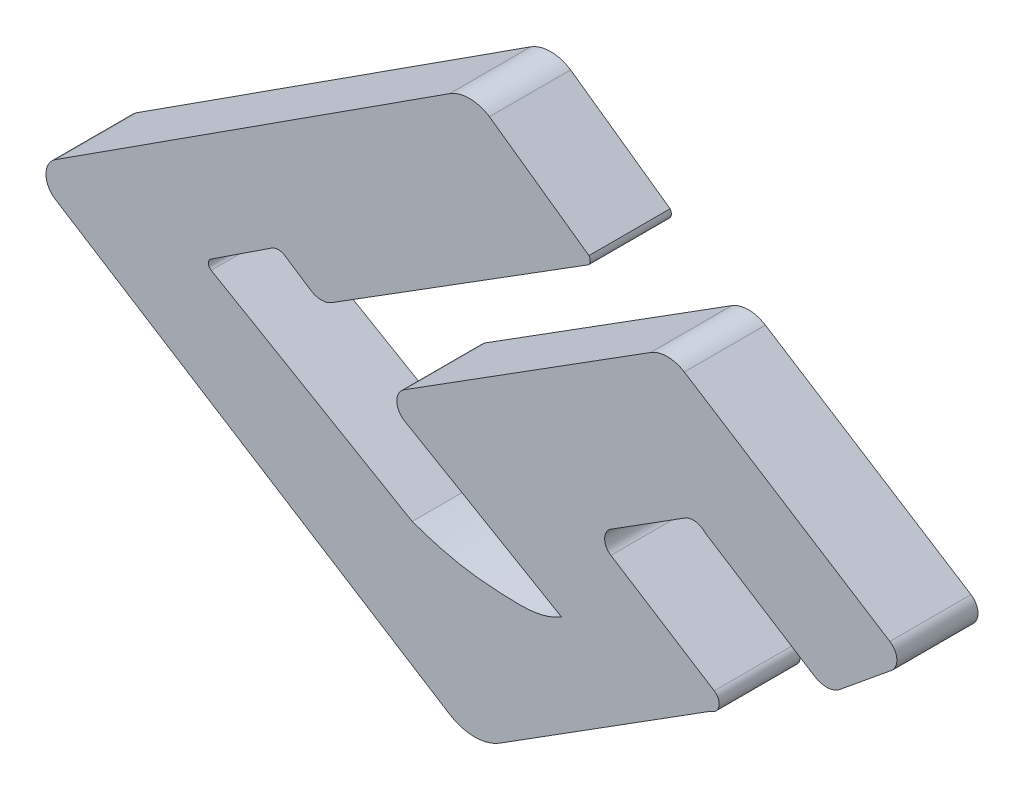
ISO-10303-21;
HEADER;
FILE_DESCRIPTION(('STEP AP214'),'2;1');
FILE_NAME('part.step','',(''),(''),'','','');
FILE_SCHEMA(('AUTOMOTIVE_DESIGN { 1 0 10303 214 1 1 1 1 }'));
ENDSEC;
DATA;
#1=APPLICATION_CONTEXT('core data for automotive mechanical design processes');
#2=APPLICATION_PROTOCOL_DEFINITION('international standard','automotive_design',2000,#1);
#3=PRODUCT_CONTEXT('',#1,'mechanical');
#4=PRODUCT('Part','Part','',(#3));
#5=PRODUCT_RELATED_PRODUCT_CATEGORY('part','',(#4));
#6=PRODUCT_DEFINITION_FORMATION('','',#4);
#7=PRODUCT_DEFINITION_CONTEXT('part definition',#1,'design');
#8=PRODUCT_DEFINITION('design','',#6,#7);
#9=PRODUCT_DEFINITION_SHAPE('','',#8);
#10=(LENGTH_UNIT() NAMED_UNIT(*) SI_UNIT(.MILLI.,.METRE.));
#11=(NAMED_UNIT(*) PLANE_ANGLE_UNIT() SI_UNIT($,.RADIAN.));
#12=(NAMED_UNIT(*) SI_UNIT($,.STERADIAN.) SOLID_ANGLE_UNIT());
#13=UNCERTAINTY_MEASURE_WITH_UNIT(LENGTH_MEASURE(1.E-05),#10,'distance_accuracy_value','');
#14=(GEOMETRIC_REPRESENTATION_CONTEXT(3) GLOBAL_UNCERTAINTY_ASSIGNED_CONTEXT((#13)) GLOBAL_UNIT_ASSIGNED_CONTEXT((#10,
#11,#12)) REPRESENTATION_CONTEXT('',''));
#15=CARTESIAN_POINT('',(0.,0.,0.));
#16=DIRECTION('',(0.,0.,1.));
#17=DIRECTION('',(1.,0.,0.));
#18=AXIS2_PLACEMENT_3D('',#15,#16,#17);
#19=CARTESIAN_POINT('',(49.264509057098,144.811864137886,13.));
#20=DIRECTION('',(0.,0.,-1.));
#21=DIRECTION('',(-1.,0.,0.));
#22=AXIS2_PLACEMENT_3D('',#19,#20,#21);
#23=CYLINDRICAL_SURFACE('',#22,3.28548810406458);
#24=CARTESIAN_POINT('',(49.264509057098,144.811864137886,0.));
#25=DIRECTION('',(0.,0.,1.));
#26=DIRECTION('',(1.,0.,0.));
#27=AXIS2_PLACEMENT_3D('',#24,#25,#26);
#28=CIRCLE('',#27,3.28548810406458);
#29=CARTESIAN_POINT('',(47.4838264596894,147.572951164626,0.));
#30=VERTEX_POINT('',#29);
#31=CARTESIAN_POINT('',(47.5114849656796,142.033134461063,0.));
#32=VERTEX_POINT('',#31);
#33=EDGE_CURVE('E272',#30,#32,#28,.T.);
#34=ORIENTED_EDGE('',*,*,#33,.T.);
#35=DIRECTION('',(0.,0.,-1.));
#36=VECTOR('',#35,1.);
#37=CARTESIAN_POINT('',(47.5114849656796,142.033134461063,13.));
#38=LINE('',#37,#36);
#39=CARTESIAN_POINT('',(47.5114849656796,142.033134461063,13.));
#40=VERTEX_POINT('',#39);
#41=EDGE_CURVE('E11',#40,#32,#38,.T.);
#42=ORIENTED_EDGE('',*,*,#41,.F.);
#43=CARTESIAN_POINT('',(49.264509057098,144.811864137886,13.));
#44=DIRECTION('',(0.,0.,1.));
#45=DIRECTION('',(1.,0.,0.));
#46=AXIS2_PLACEMENT_3D('',#43,#44,#45);
#47=CIRCLE('',#46,3.28548810406458);
#48=CARTESIAN_POINT('',(47.4838264596894,147.572951164626,13.));
#49=VERTEX_POINT('',#48);
#50=EDGE_CURVE('E365',#49,#40,#47,.T.);
#51=ORIENTED_EDGE('',*,*,#50,.F.);
#52=DIRECTION('',(0.,0.,-1.));
#53=VECTOR('',#52,1.);
#54=CARTESIAN_POINT('',(47.4838264596894,147.572951164626,13.));
#55=LINE('',#54,#53);
#56=EDGE_CURVE('E268',#49,#30,#55,.T.);
#57=ORIENTED_EDGE('',*,*,#56,.T.);
#58=EDGE_LOOP('',(#34,#42,#51,#57));
#59=FACE_BOUND('',#58,.T.);
#60=ADVANCED_FACE('F39',(#59),#23,.T.);
#61=CARTESIAN_POINT('',(47.5114849656796,142.033134461063,13.));
#62=DIRECTION('',(0.533565800846968,0.845758556661731,0.));
#63=DIRECTION('',(-0.845758556661731,0.533565800846968,0.));
#64=AXIS2_PLACEMENT_3D('',#61,#62,#63);
#65=PLANE('',#64);
#66=DIRECTION('',(0.845758556661731,-0.533565800846968,0.));
#67=VECTOR('',#66,1.);
#68=CARTESIAN_POINT('',(47.5114849656796,142.033134461063,0.));
#69=LINE('',#68,#67);
#70=CARTESIAN_POINT('',(110.638937631409,102.20776163839,0.));
#71=VERTEX_POINT('',#70);
#72=EDGE_CURVE('E276',#32,#71,#69,.T.);
#73=ORIENTED_EDGE('',*,*,#72,.T.);
#74=DIRECTION('',(0.,0.,-1.));
#75=VECTOR('',#74,1.);
#76=CARTESIAN_POINT('',(110.638937631409,102.20776163839,13.));
#77=LINE('',#76,#75);
#78=CARTESIAN_POINT('',(110.638937631409,102.20776163839,13.));
#79=VERTEX_POINT('',#78);
#80=EDGE_CURVE('E48',#79,#71,#77,.T.);
#81=ORIENTED_EDGE('',*,*,#80,.F.);
#82=DIRECTION('',(0.845758556661731,-0.533565800846968,0.));
#83=VECTOR('',#82,1.);
#84=CARTESIAN_POINT('',(47.5114849656796,142.033134461063,13.));
#85=LINE('',#84,#83);
#86=EDGE_CURVE('E165',#40,#79,#85,.T.);
#87=ORIENTED_EDGE('',*,*,#86,.F.);
#88=ORIENTED_EDGE('',*,*,#41,.T.);
#89=EDGE_LOOP('',(#73,#81,#87,#88));
#90=FACE_BOUND('',#89,.T.);
#91=ADVANCED_FACE('F613',(#90),#65,.F.);
#92=CARTESIAN_POINT('',(114.665611365363,108.590467876254,13.));
#93=DIRECTION('',(0.,0.,-1.));
#94=DIRECTION('',(-1.,0.,0.));
#95=AXIS2_PLACEMENT_3D('',#92,#93,#94);
#96=CYLINDRICAL_SURFACE('',#95,7.54672381093808);
#97=CARTESIAN_POINT('',(114.665611365363,108.590467876254,0.));
#98=DIRECTION('',(0.,0.,1.));
#99=DIRECTION('',(1.,0.,0.));
#100=AXIS2_PLACEMENT_3D('',#97,#98,#99);
#101=CIRCLE('',#100,7.54672381093808);
#102=CARTESIAN_POINT('',(118.6926498605,102.207991770755,0.));
#103=VERTEX_POINT('',#102);
#104=EDGE_CURVE('E279',#71,#103,#101,.T.);
#105=ORIENTED_EDGE('',*,*,#104,.T.);
#106=DIRECTION('',(0.,0.,-1.));
#107=VECTOR('',#106,1.);
#108=CARTESIAN_POINT('',(118.6926498605,102.207991770755,13.));
#109=LINE('',#108,#107);
#110=CARTESIAN_POINT('',(118.6926498605,102.207991770755,13.));
#111=VERTEX_POINT('',#110);
#112=EDGE_CURVE('E464',#111,#103,#109,.T.);
#113=ORIENTED_EDGE('',*,*,#112,.F.);
#114=CARTESIAN_POINT('',(114.665611365363,108.590467876254,13.));
#115=DIRECTION('',(0.,0.,1.));
#116=DIRECTION('',(1.,0.,0.));
#117=AXIS2_PLACEMENT_3D('',#114,#115,#116);
#118=CIRCLE('',#117,7.54672381093808);
#119=EDGE_CURVE('E474',#79,#111,#118,.T.);
#120=ORIENTED_EDGE('',*,*,#119,.F.);
#121=ORIENTED_EDGE('',*,*,#80,.T.);
#122=EDGE_LOOP('',(#105,#113,#120,#121));
#123=FACE_BOUND('',#122,.T.);
#124=ADVANCED_FACE('F472',(#123),#96,.T.);
#125=CARTESIAN_POINT('',(118.6926498605,102.207991770755,13.));
#126=DIRECTION('',(-0.533614134559939,0.845728062321363,0.));
#127=DIRECTION('',(-0.845728062321363,-0.533614134559939,0.));
#128=AXIS2_PLACEMENT_3D('',#125,#126,#127);
#129=PLANE('',#128);
#130=DIRECTION('',(0.845728062321363,0.533614134559939,0.));
#131=VECTOR('',#130,1.);
#132=CARTESIAN_POINT('',(118.6926498605,102.207991770755,0.));
#133=LINE('',#132,#131);
#134=CARTESIAN_POINT('',(152.521772353355,123.552557153153,0.));
#135=VERTEX_POINT('',#134);
#136=EDGE_CURVE('E282',#103,#135,#133,.T.);
#137=ORIENTED_EDGE('',*,*,#136,.T.);
#138=DIRECTION('',(0.,0.,-1.));
#139=VECTOR('',#138,1.);
#140=CARTESIAN_POINT('',(152.521772353355,123.552557153153,13.));
#141=LINE('',#140,#139);
#142=CARTESIAN_POINT('',(152.521772353355,123.552557153153,13.));
#143=VERTEX_POINT('',#142);
#144=EDGE_CURVE('E460',#143,#135,#141,.T.);
#145=ORIENTED_EDGE('',*,*,#144,.F.);
#146=DIRECTION('',(0.845728062321363,0.533614134559939,0.));
#147=VECTOR('',#146,1.);
#148=CARTESIAN_POINT('',(118.6926498605,102.207991770755,13.));
#149=LINE('',#148,#147);
#150=EDGE_CURVE('E493',#111,#143,#149,.T.);
#151=ORIENTED_EDGE('',*,*,#150,.F.);
#152=ORIENTED_EDGE('',*,*,#112,.T.);
#153=EDGE_LOOP('',(#137,#145,#151,#152));
#154=FACE_BOUND('',#153,.T.);
#155=ADVANCED_FACE('F483',(#154),#129,.F.);
#156=CARTESIAN_POINT('',(152.135711203894,125.211724771272,13.));
#157=DIRECTION('',(0.,0.,-1.));
#158=DIRECTION('',(-1.,0.,0.));
#159=AXIS2_PLACEMENT_3D('',#156,#157,#158);
#160=CYLINDRICAL_SURFACE('',#159,1.70349065043992);
#161=CARTESIAN_POINT('',(152.135711203894,125.211724771272,0.));
#162=DIRECTION('',(0.,0.,1.));
#163=DIRECTION('',(-1.,0.,0.));
#164=AXIS2_PLACEMENT_3D('',#161,#162,#163);
#165=CIRCLE('',#164,1.70349065043992);
#166=CARTESIAN_POINT('',(153.048916289825,126.649757061301,0.));
#167=VERTEX_POINT('',#166);
#168=EDGE_CURVE('E285',#135,#167,#165,.T.);
#169=ORIENTED_EDGE('',*,*,#168,.T.);
#170=DIRECTION('',(0.,0.,-1.));
#171=VECTOR('',#170,1.);
#172=CARTESIAN_POINT('',(153.048916289825,126.649757061301,13.));
#173=LINE('',#172,#171);
#174=CARTESIAN_POINT('',(153.048916289825,126.649757061301,13.));
#175=VERTEX_POINT('',#174);
#176=EDGE_CURVE('E456',#175,#167,#173,.T.);
#177=ORIENTED_EDGE('',*,*,#176,.F.);
#178=CARTESIAN_POINT('',(152.135711203894,125.211724771272,13.));
#179=DIRECTION('',(0.,0.,1.));
#180=DIRECTION('',(-1.,0.,0.));
#181=AXIS2_PLACEMENT_3D('',#178,#179,#180);
#182=CIRCLE('',#181,1.70349065043992);
#183=EDGE_CURVE('E489',#143,#175,#182,.T.);
#184=ORIENTED_EDGE('',*,*,#183,.F.);
#185=ORIENTED_EDGE('',*,*,#144,.T.);
#186=EDGE_LOOP('',(#169,#177,#184,#185));
#187=FACE_BOUND('',#186,.T.);
#188=ADVANCED_FACE('F487',(#187),#160,.T.);
#189=CARTESIAN_POINT('',(136.489129491724,137.165850219145,13.));
#190=DIRECTION('',(-0.536078719125375,-0.844167996847131,0.));
#191=DIRECTION('',(0.844167996847131,-0.536078719125375,0.));
#192=AXIS2_PLACEMENT_3D('',#189,#190,#191);
#193=PLANE('',#192);
#194=DIRECTION('',(-0.844167996847131,0.536078719125375,0.));
#195=VECTOR('',#194,1.);
#196=CARTESIAN_POINT('',(136.489129491724,137.165850219145,0.));
#197=LINE('',#196,#195);
#198=CARTESIAN_POINT('',(136.489129491724,137.165850219145,0.));
#199=VERTEX_POINT('',#198);
#200=EDGE_CURVE('E288',#167,#199,#197,.T.);
#201=ORIENTED_EDGE('',*,*,#200,.T.);
#202=DIRECTION('',(0.,0.,-1.));
#203=VECTOR('',#202,1.);
#204=CARTESIAN_POINT('',(136.489129491724,137.165850219145,13.));
#205=LINE('',#204,#203);
#206=CARTESIAN_POINT('',(136.489129491724,137.165850219145,13.));
#207=VERTEX_POINT('',#206);
#208=EDGE_CURVE('E452',#207,#199,#205,.T.);
#209=ORIENTED_EDGE('',*,*,#208,.F.);
#210=DIRECTION('',(-0.844167996847131,0.536078719125375,0.));
#211=VECTOR('',#210,1.);
#212=CARTESIAN_POINT('',(136.489129491724,137.165850219145,13.));
#213=LINE('',#212,#211);
#214=EDGE_CURVE('E492',#175,#207,#213,.T.);
#215=ORIENTED_EDGE('',*,*,#214,.F.);
#216=ORIENTED_EDGE('',*,*,#176,.T.);
#217=EDGE_LOOP('',(#201,#209,#215,#216));
#218=FACE_BOUND('',#217,.T.);
#219=ADVANCED_FACE('F603',(#218),#193,.F.);
#220=CARTESIAN_POINT('',(137.641298536826,138.980181212215,13.));
#221=DIRECTION('',(0.,0.,-1.));
#222=DIRECTION('',(-1.,0.,0.));
#223=AXIS2_PLACEMENT_3D('',#220,#221,#222);
#224=CYLINDRICAL_SURFACE('',#223,2.14925346595167);
#225=CARTESIAN_POINT('',(137.641298536826,138.980181212215,0.));
#226=DIRECTION('',(0.,0.,-1.));
#227=DIRECTION('',(1.,0.,0.));
#228=AXIS2_PLACEMENT_3D('',#225,#226,#227);
#229=CIRCLE('',#228,2.14925346595167);
#230=CARTESIAN_POINT('',(136.494426508643,140.797865181412,0.));
#231=VERTEX_POINT('',#230);
#232=EDGE_CURVE('E291',#199,#231,#229,.T.);
#233=ORIENTED_EDGE('',*,*,#232,.T.);
#234=DIRECTION('',(0.,0.,-1.));
#235=VECTOR('',#234,1.);
#236=CARTESIAN_POINT('',(136.494426508643,140.797865181412,13.));
#237=LINE('',#236,#235);
#238=CARTESIAN_POINT('',(136.494426508643,140.797865181412,13.));
#239=VERTEX_POINT('',#238);
#240=EDGE_CURVE('E448',#239,#231,#237,.T.);
#241=ORIENTED_EDGE('',*,*,#240,.F.);
#242=CARTESIAN_POINT('',(137.641298536826,138.980181212215,13.));
#243=DIRECTION('',(0.,0.,-1.));
#244=DIRECTION('',(1.,0.,0.));
#245=AXIS2_PLACEMENT_3D('',#242,#243,#244);
#246=CIRCLE('',#245,2.14925346595167);
#247=EDGE_CURVE('E497',#207,#239,#246,.T.);
#248=ORIENTED_EDGE('',*,*,#247,.F.);
#249=ORIENTED_EDGE('',*,*,#208,.T.);
#250=EDGE_LOOP('',(#233,#241,#248,#249));
#251=FACE_BOUND('',#250,.T.);
#252=ADVANCED_FACE('F599',(#251),#224,.F.);
#253=CARTESIAN_POINT('',(136.494426508643,140.797865181412,13.));
#254=DIRECTION('',(-0.533614134559938,0.845728062321364,0.));
#255=DIRECTION('',(-0.845728062321364,-0.533614134559938,0.));
#256=AXIS2_PLACEMENT_3D('',#253,#254,#255);
#257=PLANE('',#256);
#258=DIRECTION('',(0.845728062321364,0.533614134559938,0.));
#259=VECTOR('',#258,1.);
#260=CARTESIAN_POINT('',(136.494426508643,140.797865181412,0.));
#261=LINE('',#260,#259);
#262=CARTESIAN_POINT('',(148.334619381142,148.268463065251,0.));
#263=VERTEX_POINT('',#262);
#264=EDGE_CURVE('E294',#231,#263,#261,.T.);
#265=ORIENTED_EDGE('',*,*,#264,.T.);
#266=DIRECTION('',(0.,0.,-1.));
#267=VECTOR('',#266,1.);
#268=CARTESIAN_POINT('',(148.334619381142,148.268463065251,13.));
#269=LINE('',#268,#267);
#270=CARTESIAN_POINT('',(148.334619381142,148.268463065251,13.));
#271=VERTEX_POINT('',#270);
#272=EDGE_CURVE('E444',#271,#263,#269,.T.);
#273=ORIENTED_EDGE('',*,*,#272,.F.);
#274=DIRECTION('',(0.845728062321364,0.533614134559938,0.));
#275=VECTOR('',#274,1.);
#276=CARTESIAN_POINT('',(136.494426508643,140.797865181412,13.));
#277=LINE('',#276,#275);
#278=EDGE_CURVE('E504',#239,#271,#277,.T.);
#279=ORIENTED_EDGE('',*,*,#278,.F.);
#280=ORIENTED_EDGE('',*,*,#240,.T.);
#281=EDGE_LOOP('',(#265,#273,#279,#280));
#282=FACE_BOUND('',#281,.T.);
#283=ADVANCED_FACE('F595',(#282),#257,.F.);
#284=CARTESIAN_POINT('',(149.71222882834,146.085082054596,13.));
#285=DIRECTION('',(0.,0.,-1.));
#286=DIRECTION('',(-1.,0.,0.));
#287=AXIS2_PLACEMENT_3D('',#284,#285,#286);
#288=CYLINDRICAL_SURFACE('',#287,2.58165846437967);
#289=CARTESIAN_POINT('',(149.71222882834,146.085082054596,0.));
#290=DIRECTION('',(0.,0.,-1.));
#291=DIRECTION('',(-1.,0.,0.));
#292=AXIS2_PLACEMENT_3D('',#289,#290,#291);
#293=CIRCLE('',#292,2.58165846437967);
#294=CARTESIAN_POINT('',(151.618362397803,147.826235477494,0.));
#295=VERTEX_POINT('',#294);
#296=EDGE_CURVE('E297',#263,#295,#293,.T.);
#297=ORIENTED_EDGE('',*,*,#296,.T.);
#298=DIRECTION('',(0.,0.,-1.));
#299=VECTOR('',#298,1.);
#300=CARTESIAN_POINT('',(151.618362397803,147.826235477494,13.));
#301=LINE('',#300,#299);
#302=CARTESIAN_POINT('',(151.618362397803,147.826235477494,13.));
#303=VERTEX_POINT('',#302);
#304=EDGE_CURVE('E440',#303,#295,#301,.T.);
#305=ORIENTED_EDGE('',*,*,#304,.F.);
#306=CARTESIAN_POINT('',(149.71222882834,146.085082054596,13.));
#307=DIRECTION('',(0.,0.,-1.));
#308=DIRECTION('',(-1.,0.,0.));
#309=AXIS2_PLACEMENT_3D('',#306,#307,#308);
#310=CIRCLE('',#309,2.58165846437967);
#311=EDGE_CURVE('E507',#271,#303,#310,.T.);
#312=ORIENTED_EDGE('',*,*,#311,.F.);
#313=ORIENTED_EDGE('',*,*,#272,.T.);
#314=EDGE_LOOP('',(#297,#305,#312,#313));
#315=FACE_BOUND('',#314,.T.);
#316=ADVANCED_FACE('F591',(#315),#288,.F.);
#317=CARTESIAN_POINT('',(151.618362397803,147.826235477495,13.));
#318=DIRECTION('',(0.536078719125397,0.844167996847117,0.));
#319=DIRECTION('',(-0.844167996847117,0.536078719125397,0.));
#320=AXIS2_PLACEMENT_3D('',#317,#318,#319);
#321=PLANE('',#320);
#322=DIRECTION('',(0.844167996847117,-0.536078719125397,0.));
#323=VECTOR('',#322,1.);
#324=CARTESIAN_POINT('',(151.618362397803,147.826235477495,0.));
#325=LINE('',#324,#323);
#326=CARTESIAN_POINT('',(169.121860530008,136.710849803113,0.));
#327=VERTEX_POINT('',#326);
#328=EDGE_CURVE('E300',#295,#327,#325,.T.);
#329=ORIENTED_EDGE('',*,*,#328,.T.);
#330=DIRECTION('',(0.,0.,-1.));
#331=VECTOR('',#330,1.);
#332=CARTESIAN_POINT('',(169.121860530008,136.710849803113,13.));
#333=LINE('',#332,#331);
#334=CARTESIAN_POINT('',(169.121860530008,136.710849803113,13.));
#335=VERTEX_POINT('',#334);
#336=EDGE_CURVE('E436',#335,#327,#333,.T.);
#337=ORIENTED_EDGE('',*,*,#336,.F.);
#338=DIRECTION('',(0.844167996847117,-0.536078719125397,0.));
#339=VECTOR('',#338,1.);
#340=CARTESIAN_POINT('',(151.618362397803,147.826235477495,13.));
#341=LINE('',#340,#339);
#342=EDGE_CURVE('E510',#303,#335,#341,.T.);
#343=ORIENTED_EDGE('',*,*,#342,.F.);
#344=ORIENTED_EDGE('',*,*,#304,.T.);
#345=EDGE_LOOP('',(#329,#337,#343,#344));
#346=FACE_BOUND('',#345,.T.);
#347=ADVANCED_FACE('F587',(#346),#321,.F.);
#348=CARTESIAN_POINT('',(171.033857416529,139.721688555126,13.));
#349=DIRECTION('',(0.,0.,-1.));
#350=DIRECTION('',(-1.,0.,0.));
#351=AXIS2_PLACEMENT_3D('',#348,#349,#350);
#352=CYLINDRICAL_SURFACE('',#351,3.56663456001427);
#353=CARTESIAN_POINT('',(171.033857416529,139.721688555126,0.));
#354=DIRECTION('',(0.,0.,1.));
#355=DIRECTION('',(1.,0.,0.));
#356=AXIS2_PLACEMENT_3D('',#353,#354,#355);
#357=CIRCLE('',#356,3.56663456001427);
#358=CARTESIAN_POINT('',(172.945854303051,136.710849803114,0.));
#359=VERTEX_POINT('',#358);
#360=EDGE_CURVE('E303',#327,#359,#357,.T.);
#361=ORIENTED_EDGE('',*,*,#360,.T.);
#362=DIRECTION('',(0.,0.,-1.));
#363=VECTOR('',#362,1.);
#364=CARTESIAN_POINT('',(172.945854303051,136.710849803114,13.));
#365=LINE('',#364,#363);
#366=CARTESIAN_POINT('',(172.945854303051,136.710849803114,13.));
#367=VERTEX_POINT('',#366);
#368=EDGE_CURVE('E432',#367,#359,#365,.T.);
#369=ORIENTED_EDGE('',*,*,#368,.F.);
#370=CARTESIAN_POINT('',(171.033857416529,139.721688555126,13.));
#371=DIRECTION('',(0.,0.,1.));
#372=DIRECTION('',(1.,0.,0.));
#373=AXIS2_PLACEMENT_3D('',#370,#371,#372);
#374=CIRCLE('',#373,3.56663456001427);
#375=EDGE_CURVE('E513',#335,#367,#374,.T.);
#376=ORIENTED_EDGE('',*,*,#375,.F.);
#377=ORIENTED_EDGE('',*,*,#336,.T.);
#378=EDGE_LOOP('',(#361,#369,#376,#377));
#379=FACE_BOUND('',#378,.T.);
#380=ADVANCED_FACE('F583',(#379),#352,.T.);
#381=CARTESIAN_POINT('',(172.945854303051,136.710849803114,13.));
#382=DIRECTION('',(-0.633855450804034,0.773451528853628,0.));
#383=DIRECTION('',(-0.773451528853628,-0.633855450804034,0.));
#384=AXIS2_PLACEMENT_3D('',#381,#382,#383);
#385=PLANE('',#384);
#386=DIRECTION('',(0.773451528853628,0.633855450804034,0.));
#387=VECTOR('',#386,1.);
#388=CARTESIAN_POINT('',(172.945854303051,136.710849803114,0.));
#389=LINE('',#388,#387);
#390=CARTESIAN_POINT('',(181.186021630079,143.463793951424,0.));
#391=VERTEX_POINT('',#390);
#392=EDGE_CURVE('E306',#359,#391,#389,.T.);
#393=ORIENTED_EDGE('',*,*,#392,.T.);
#394=DIRECTION('',(0.,0.,-1.));
#395=VECTOR('',#394,1.);
#396=CARTESIAN_POINT('',(181.186021630079,143.463793951424,13.));
#397=LINE('',#396,#395);
#398=CARTESIAN_POINT('',(181.186021630079,143.463793951424,13.));
#399=VERTEX_POINT('',#398);
#400=EDGE_CURVE('E428',#399,#391,#397,.T.);
#401=ORIENTED_EDGE('',*,*,#400,.F.);
#402=DIRECTION('',(0.773451528853628,0.633855450804034,0.));
#403=VECTOR('',#402,1.);
#404=CARTESIAN_POINT('',(172.945854303051,136.710849803114,13.));
#405=LINE('',#404,#403);
#406=EDGE_CURVE('E516',#367,#399,#405,.T.);
#407=ORIENTED_EDGE('',*,*,#406,.F.);
#408=ORIENTED_EDGE('',*,*,#368,.T.);
#409=EDGE_LOOP('',(#393,#401,#407,#408));
#410=FACE_BOUND('',#409,.T.);
#411=ADVANCED_FACE('F579',(#410),#385,.F.);
#412=CARTESIAN_POINT('',(179.881330216291,145.518303294897,13.));
#413=DIRECTION('',(0.,0.,-1.));
#414=DIRECTION('',(-1.,0.,0.));
#415=AXIS2_PLACEMENT_3D('',#412,#413,#414);
#416=CYLINDRICAL_SURFACE('',#415,2.43376833894047);
#417=CARTESIAN_POINT('',(179.881330216291,145.518303294897,0.));
#418=DIRECTION('',(0.,0.,1.));
#419=DIRECTION('',(-1.,0.,0.));
#420=AXIS2_PLACEMENT_3D('',#417,#418,#419);
#421=CIRCLE('',#420,2.43376833894047);
#422=CARTESIAN_POINT('',(181.186021630077,147.57281263837,0.));
#423=VERTEX_POINT('',#422);
#424=EDGE_CURVE('E309',#391,#423,#421,.T.);
#425=ORIENTED_EDGE('',*,*,#424,.T.);
#426=DIRECTION('',(0.,0.,-1.));
#427=VECTOR('',#426,1.);
#428=CARTESIAN_POINT('',(181.186021630077,147.57281263837,13.));
#429=LINE('',#428,#427);
#430=CARTESIAN_POINT('',(181.186021630077,147.57281263837,13.));
#431=VERTEX_POINT('',#430);
#432=EDGE_CURVE('E424',#431,#423,#429,.T.);
#433=ORIENTED_EDGE('',*,*,#432,.F.);
#434=CARTESIAN_POINT('',(179.881330216291,145.518303294897,13.));
#435=DIRECTION('',(0.,0.,1.));
#436=DIRECTION('',(-1.,0.,0.));
#437=AXIS2_PLACEMENT_3D('',#434,#435,#436);
#438=CIRCLE('',#437,2.43376833894047);
#439=EDGE_CURVE('E519',#399,#431,#438,.T.);
#440=ORIENTED_EDGE('',*,*,#439,.F.);
#441=ORIENTED_EDGE('',*,*,#400,.T.);
#442=EDGE_LOOP('',(#425,#433,#440,#441));
#443=FACE_BOUND('',#442,.T.);
#444=ADVANCED_FACE('F575',(#443),#416,.T.);
#445=CARTESIAN_POINT('',(148.253033070464,168.486510373829,13.));
#446=DIRECTION('',(-0.536078719125377,-0.84416799684713,0.));
#447=DIRECTION('',(0.84416799684713,-0.536078719125377,0.));
#448=AXIS2_PLACEMENT_3D('',#445,#446,#447);
#449=PLANE('',#448);
#450=DIRECTION('',(-0.84416799684713,0.536078719125377,0.));
#451=VECTOR('',#450,1.);
#452=CARTESIAN_POINT('',(148.253033070464,168.486510373829,0.));
#453=LINE('',#452,#451);
#454=CARTESIAN_POINT('',(148.253033070464,168.486510373829,0.));
#455=VERTEX_POINT('',#454);
#456=EDGE_CURVE('E312',#423,#455,#453,.T.);
#457=ORIENTED_EDGE('',*,*,#456,.T.);
#458=DIRECTION('',(0.,0.,-1.));
#459=VECTOR('',#458,1.);
#460=CARTESIAN_POINT('',(148.253033070464,168.486510373829,13.));
#461=LINE('',#460,#459);
#462=CARTESIAN_POINT('',(148.253033070464,168.486510373829,13.));
#463=VERTEX_POINT('',#462);
#464=EDGE_CURVE('E420',#463,#455,#461,.T.);
#465=ORIENTED_EDGE('',*,*,#464,.F.);
#466=DIRECTION('',(-0.84416799684713,0.536078719125377,0.));
#467=VECTOR('',#466,1.);
#468=CARTESIAN_POINT('',(148.253033070464,168.486510373829,13.));
#469=LINE('',#468,#467);
#470=EDGE_CURVE('E522',#431,#463,#469,.T.);
#471=ORIENTED_EDGE('',*,*,#470,.F.);
#472=ORIENTED_EDGE('',*,*,#432,.T.);
#473=EDGE_LOOP('',(#457,#465,#471,#472));
#474=FACE_BOUND('',#473,.T.);
#475=ADVANCED_FACE('F571',(#474),#449,.F.);
#476=CARTESIAN_POINT('',(145.543154130491,164.219239551761,13.));
#477=DIRECTION('',(0.,0.,-1.));
#478=DIRECTION('',(-1.,0.,0.));
#479=AXIS2_PLACEMENT_3D('',#476,#477,#478);
#480=CYLINDRICAL_SURFACE('',#479,5.05500189299478);
#481=CARTESIAN_POINT('',(145.543154130491,164.219239551761,0.));
#482=DIRECTION('',(0.,0.,1.));
#483=DIRECTION('',(-1.,0.,0.));
#484=AXIS2_PLACEMENT_3D('',#481,#482,#483);
#485=CIRCLE('',#484,5.05500189299478);
#486=CARTESIAN_POINT('',(142.845733670162,168.494396507754,0.));
#487=VERTEX_POINT('',#486);
#488=EDGE_CURVE('E315',#455,#487,#485,.T.);
#489=ORIENTED_EDGE('',*,*,#488,.T.);
#490=DIRECTION('',(0.,0.,-1.));
#491=VECTOR('',#490,1.);
#492=CARTESIAN_POINT('',(142.845733670162,168.494396507754,13.));
#493=LINE('',#492,#491);
#494=CARTESIAN_POINT('',(142.845733670162,168.494396507754,13.));
#495=VERTEX_POINT('',#494);
#496=EDGE_CURVE('E416',#495,#487,#493,.T.);
#497=ORIENTED_EDGE('',*,*,#496,.F.);
#498=CARTESIAN_POINT('',(145.543154130491,164.219239551761,13.));
#499=DIRECTION('',(0.,0.,1.));
#500=DIRECTION('',(-1.,0.,0.));
#501=AXIS2_PLACEMENT_3D('',#498,#499,#500);
#502=CIRCLE('',#501,5.05500189299478);
#503=EDGE_CURVE('E525',#463,#495,#502,.T.);
#504=ORIENTED_EDGE('',*,*,#503,.F.);
#505=ORIENTED_EDGE('',*,*,#464,.T.);
#506=EDGE_LOOP('',(#489,#497,#504,#505));
#507=FACE_BOUND('',#506,.T.);
#508=ADVANCED_FACE('F567',(#507),#480,.T.);
#509=CARTESIAN_POINT('',(142.845733670162,168.494396507754,13.));
#510=DIRECTION('',(0.533614134559939,-0.845728062321363,0.));
#511=DIRECTION('',(0.845728062321363,0.533614134559939,0.));
#512=AXIS2_PLACEMENT_3D('',#509,#510,#511);
#513=PLANE('',#512);
#514=DIRECTION('',(-0.845728062321363,-0.533614134559939,0.));
#515=VECTOR('',#514,1.);
#516=CARTESIAN_POINT('',(142.845733670162,168.494396507754,0.));
#517=LINE('',#516,#515);
#518=CARTESIAN_POINT('',(103.370364427947,143.587318295403,0.));
#519=VERTEX_POINT('',#518);
#520=EDGE_CURVE('E318',#487,#519,#517,.T.);
#521=ORIENTED_EDGE('',*,*,#520,.T.);
#522=DIRECTION('',(0.,0.,-1.));
#523=VECTOR('',#522,1.);
#524=CARTESIAN_POINT('',(103.370364427947,143.587318295403,13.));
#525=LINE('',#524,#523);
#526=CARTESIAN_POINT('',(103.370364427947,143.587318295403,13.));
#527=VERTEX_POINT('',#526);
#528=EDGE_CURVE('E412',#527,#519,#525,.T.);
#529=ORIENTED_EDGE('',*,*,#528,.F.);
#530=DIRECTION('',(-0.845728062321363,-0.533614134559939,0.));
#531=VECTOR('',#530,1.);
#532=CARTESIAN_POINT('',(142.845733670162,168.494396507754,13.));
#533=LINE('',#532,#531);
#534=EDGE_CURVE('E528',#495,#527,#533,.T.);
#535=ORIENTED_EDGE('',*,*,#534,.F.);
#536=ORIENTED_EDGE('',*,*,#496,.T.);
#537=EDGE_LOOP('',(#521,#529,#535,#536));
#538=FACE_BOUND('',#537,.T.);
#539=ADVANCED_FACE('F563',(#538),#513,.F.);
#540=CARTESIAN_POINT('',(104.714062323467,141.457683894955,13.));
#541=DIRECTION('',(0.,0.,-1.));
#542=DIRECTION('',(-1.,0.,0.));
#543=AXIS2_PLACEMENT_3D('',#540,#541,#542);
#544=CYLINDRICAL_SURFACE('',#543,2.51810776457191);
#545=CARTESIAN_POINT('',(104.714062323467,141.457683894955,0.));
#546=DIRECTION('',(0.,0.,1.));
#547=DIRECTION('',(1.,0.,0.));
#548=AXIS2_PLACEMENT_3D('',#545,#546,#547);
#549=CIRCLE('',#548,2.51810776457191);
#550=CARTESIAN_POINT('',(103.370375955747,139.328042221058,0.));
#551=VERTEX_POINT('',#550);
#552=EDGE_CURVE('E321',#519,#551,#549,.T.);
#553=ORIENTED_EDGE('',*,*,#552,.T.);
#554=DIRECTION('',(0.,0.,-1.));
#555=VECTOR('',#554,1.);
#556=CARTESIAN_POINT('',(103.370375955747,139.328042221058,13.));
#557=LINE('',#556,#555);
#558=CARTESIAN_POINT('',(103.370375955747,139.328042221058,13.));
#559=VERTEX_POINT('',#558);
#560=EDGE_CURVE('E408',#559,#551,#557,.T.);
#561=ORIENTED_EDGE('',*,*,#560,.F.);
#562=CARTESIAN_POINT('',(104.714062323467,141.457683894955,13.));
#563=DIRECTION('',(0.,0.,1.));
#564=DIRECTION('',(1.,0.,0.));
#565=AXIS2_PLACEMENT_3D('',#562,#563,#564);
#566=CIRCLE('',#565,2.51810776457191);
#567=EDGE_CURVE('E531',#527,#559,#566,.T.);
#568=ORIENTED_EDGE('',*,*,#567,.F.);
#569=ORIENTED_EDGE('',*,*,#528,.T.);
#570=EDGE_LOOP('',(#553,#561,#568,#569));
#571=FACE_BOUND('',#570,.T.);
#572=ADVANCED_FACE('F559',(#571),#544,.T.);
#573=CARTESIAN_POINT('',(103.370375955747,139.328042221057,13.));
#574=DIRECTION('',(0.50293756535995,0.864322743742062,0.));
#575=DIRECTION('',(-0.864322743742062,0.50293756535995,0.));
#576=AXIS2_PLACEMENT_3D('',#573,#574,#575);
#577=PLANE('',#576);
#578=DIRECTION('',(0.864322743742062,-0.50293756535995,0.));
#579=VECTOR('',#578,1.);
#580=CARTESIAN_POINT('',(103.370375955747,139.328042221057,0.));
#581=LINE('',#580,#579);
#582=CARTESIAN_POINT('',(128.55687663966,124.672362469925,0.));
#583=VERTEX_POINT('',#582);
#584=EDGE_CURVE('E324',#551,#583,#581,.T.);
#585=ORIENTED_EDGE('',*,*,#584,.T.);
#586=DIRECTION('',(0.,0.,-1.));
#587=VECTOR('',#586,1.);
#588=CARTESIAN_POINT('',(128.55687663966,124.672362469925,13.));
#589=LINE('',#588,#587);
#590=CARTESIAN_POINT('',(128.55687663966,124.672362469925,13.));
#591=VERTEX_POINT('',#590);
#592=EDGE_CURVE('E404',#591,#583,#589,.T.);
#593=ORIENTED_EDGE('',*,*,#592,.F.);
#594=DIRECTION('',(0.864322743742062,-0.50293756535995,0.));
#595=VECTOR('',#594,1.);
#596=CARTESIAN_POINT('',(103.370375955747,139.328042221057,13.));
#597=LINE('',#596,#595);
#598=EDGE_CURVE('E534',#559,#591,#597,.T.);
#599=ORIENTED_EDGE('',*,*,#598,.F.);
#600=ORIENTED_EDGE('',*,*,#560,.T.);
#601=EDGE_LOOP('',(#585,#593,#599,#600));
#602=FACE_BOUND('',#601,.T.);
#603=ADVANCED_FACE('F554',(#602),#577,.F.);
#604=CARTESIAN_POINT('',(128.55687663966,124.672362469925,13.));
#605=CARTESIAN_POINT('',(125.679246688271,122.847455284052,13.));
#606=CARTESIAN_POINT('',(120.557961740261,122.941026513389,13.));
#607=CARTESIAN_POINT('',(112.42997818886,123.51886029352,13.));
#608=CARTESIAN_POINT('',(107.630554523751,124.900634476312,13.));
#609=CARTESIAN_POINT('',(104.659407222905,125.9554358795,13.));
#610=B_SPLINE_CURVE_WITH_KNOTS('',3,(#604,#605,#606,#607,#608,#609),.UNSPECIFIED.,.F.,.F.,(4,1,
1,4),(0.,0.395982507084249,0.61241289341648,1.),.UNSPECIFIED.);
#611=DIRECTION('',(0.,0.,-1.));
#612=VECTOR('',#611,1.);
#613=SURFACE_OF_LINEAR_EXTRUSION('',#610,#612);
#614=CARTESIAN_POINT('',(128.55687663966,124.672362469925,0.));
#615=CARTESIAN_POINT('',(125.679246688271,122.847455284052,0.));
#616=CARTESIAN_POINT('',(120.557961740261,122.941026513389,0.));
#617=CARTESIAN_POINT('',(112.42997818886,123.51886029352,0.));
#618=CARTESIAN_POINT('',(107.630554523751,124.900634476312,0.));
#619=CARTESIAN_POINT('',(104.659407222905,125.9554358795,0.));
#620=B_SPLINE_CURVE_WITH_KNOTS('',3,(#614,#615,#616,#617,#618,#619),.UNSPECIFIED.,.F.,.F.,(4,1,
1,4),(0.,0.395982507084249,0.61241289341648,1.),.UNSPECIFIED.);
#621=CARTESIAN_POINT('',(104.659407222905,125.9554358795,0.));
#622=VERTEX_POINT('',#621);
#623=EDGE_CURVE('E327',#583,#622,#620,.T.);
#624=ORIENTED_EDGE('',*,*,#623,.T.);
#625=DIRECTION('',(0.,0.,-1.));
#626=VECTOR('',#625,1.);
#627=CARTESIAN_POINT('',(104.659407222905,125.9554358795,13.));
#628=LINE('',#627,#626);
#629=CARTESIAN_POINT('',(104.659407222905,125.9554358795,13.));
#630=VERTEX_POINT('',#629);
#631=EDGE_CURVE('E400',#630,#622,#628,.T.);
#632=ORIENTED_EDGE('',*,*,#631,.F.);
#633=EDGE_CURVE('E537',#591,#630,#610,.T.);
#634=ORIENTED_EDGE('',*,*,#633,.F.);
#635=ORIENTED_EDGE('',*,*,#592,.T.);
#636=EDGE_LOOP('',(#624,#632,#634,#635));
#637=FACE_BOUND('',#636,.T.);
#638=ADVANCED_FACE('F549',(#637),#613,.F.);
#639=CARTESIAN_POINT('',(72.4525109172909,144.696187679709,13.));
#640=DIRECTION('',(-0.50293756535995,-0.864322743742062,0.));
#641=DIRECTION('',(0.864322743742062,-0.50293756535995,0.));
#642=AXIS2_PLACEMENT_3D('',#639,#640,#641);
#643=PLANE('',#642);
#644=DIRECTION('',(-0.864322743742062,0.50293756535995,0.));
#645=VECTOR('',#644,1.);
#646=CARTESIAN_POINT('',(72.4525109172909,144.696187679709,0.));
#647=LINE('',#646,#645);
#648=CARTESIAN_POINT('',(72.4525109172909,144.696187679709,0.));
#649=VERTEX_POINT('',#648);
#650=EDGE_CURVE('E332',#622,#649,#647,.T.);
#651=ORIENTED_EDGE('',*,*,#650,.T.);
#652=DIRECTION('',(0.,0.,-1.));
#653=VECTOR('',#652,1.);
#654=CARTESIAN_POINT('',(72.4525109172909,144.696187679709,13.));
#655=LINE('',#654,#653);
#656=CARTESIAN_POINT('',(72.4525109172909,144.696187679709,13.));
#657=VERTEX_POINT('',#656);
#658=EDGE_CURVE('E396',#657,#649,#655,.T.);
#659=ORIENTED_EDGE('',*,*,#658,.F.);
#660=DIRECTION('',(-0.864322743742062,0.50293756535995,0.));
#661=VECTOR('',#660,1.);
#662=CARTESIAN_POINT('',(72.4525109172909,144.696187679709,13.));
#663=LINE('',#662,#661);
#664=EDGE_CURVE('E543',#630,#657,#663,.T.);
#665=ORIENTED_EDGE('',*,*,#664,.F.);
#666=ORIENTED_EDGE('',*,*,#631,.T.);
#667=EDGE_LOOP('',(#651,#659,#665,#666));
#668=FACE_BOUND('',#667,.T.);
#669=ADVANCED_FACE('F553',(#668),#643,.F.);
#670=CARTESIAN_POINT('',(72.9080824310871,145.479109552911,13.));
#671=DIRECTION('',(0.,0.,-1.));
#672=DIRECTION('',(-1.,0.,0.));
#673=AXIS2_PLACEMENT_3D('',#670,#671,#672);
#674=CYLINDRICAL_SURFACE('',#673,0.905821209577251);
#675=CARTESIAN_POINT('',(72.9080824310871,145.479109552911,0.));
#676=DIRECTION('',(0.,0.,-1.));
#677=DIRECTION('',(1.,0.,0.));
#678=AXIS2_PLACEMENT_3D('',#675,#676,#677);
#679=CIRCLE('',#678,0.905821209577251);
#680=CARTESIAN_POINT('',(72.4106254535188,146.236109301384,0.));
#681=VERTEX_POINT('',#680);
#682=EDGE_CURVE('E338',#649,#681,#679,.T.);
#683=ORIENTED_EDGE('',*,*,#682,.T.);
#684=DIRECTION('',(0.,0.,-1.));
#685=VECTOR('',#684,1.);
#686=CARTESIAN_POINT('',(72.4106254535188,146.236109301384,13.));
#687=LINE('',#686,#685);
#688=CARTESIAN_POINT('',(72.4106254535188,146.236109301384,13.));
#689=VERTEX_POINT('',#688);
#690=EDGE_CURVE('E392',#689,#681,#687,.T.);
#691=ORIENTED_EDGE('',*,*,#690,.F.);
#692=CARTESIAN_POINT('',(72.9080824310871,145.479109552911,13.));
#693=DIRECTION('',(0.,0.,-1.));
#694=DIRECTION('',(1.,0.,0.));
#695=AXIS2_PLACEMENT_3D('',#692,#693,#694);
#696=CIRCLE('',#695,0.905821209577251);
#697=EDGE_CURVE('E662',#657,#689,#696,.T.);
#698=ORIENTED_EDGE('',*,*,#697,.F.);
#699=ORIENTED_EDGE('',*,*,#658,.T.);
#700=EDGE_LOOP('',(#683,#691,#698,#699));
#701=FACE_BOUND('',#700,.T.);
#702=ADVANCED_FACE('F659',(#701),#674,.F.);
#703=CARTESIAN_POINT('',(72.4106254535188,146.236109301384,13.));
#704=DIRECTION('',(-0.549177886660835,0.835705479701276,0.));
#705=DIRECTION('',(-0.835705479701276,-0.549177886660835,0.));
#706=AXIS2_PLACEMENT_3D('',#703,#704,#705);
#707=PLANE('',#706);
#708=DIRECTION('',(0.835705479701276,0.549177886660835,0.));
#709=VECTOR('',#708,1.);
#710=CARTESIAN_POINT('',(72.4106254535188,146.236109301384,0.));
#711=LINE('',#710,#709);
#712=CARTESIAN_POINT('',(82.1498988014387,152.636203215731,0.));
#713=VERTEX_POINT('',#712);
#714=EDGE_CURVE('E341',#681,#713,#711,.T.);
#715=ORIENTED_EDGE('',*,*,#714,.T.);
#716=DIRECTION('',(0.,0.,-1.));
#717=VECTOR('',#716,1.);
#718=CARTESIAN_POINT('',(82.1498988014387,152.636203215731,13.));
#719=LINE('',#718,#717);
#720=CARTESIAN_POINT('',(82.1498988014387,152.636203215731,13.));
#721=VERTEX_POINT('',#720);
#722=EDGE_CURVE('E388',#721,#713,#719,.T.);
#723=ORIENTED_EDGE('',*,*,#722,.F.);
#724=DIRECTION('',(0.835705479701276,0.549177886660835,0.));
#725=VECTOR('',#724,1.);
#726=CARTESIAN_POINT('',(72.4106254535188,146.236109301384,13.));
#727=LINE('',#726,#725);
#728=EDGE_CURVE('E653',#689,#721,#727,.T.);
#729=ORIENTED_EDGE('',*,*,#728,.F.);
#730=ORIENTED_EDGE('',*,*,#690,.T.);
#731=EDGE_LOOP('',(#715,#723,#729,#730));
#732=FACE_BOUND('',#731,.T.);
#733=ADVANCED_FACE('F652',(#732),#707,.F.);
#734=CARTESIAN_POINT('',(83.2074415571014,151.026899022331,13.));
#735=DIRECTION('',(0.,0.,-1.));
#736=DIRECTION('',(-1.,0.,0.));
#737=AXIS2_PLACEMENT_3D('',#734,#735,#736);
#738=CYLINDRICAL_SURFACE('',#737,1.92568342853881);
#739=CARTESIAN_POINT('',(83.2074415571014,151.026899022331,0.));
#740=DIRECTION('',(0.,0.,-1.));
#741=DIRECTION('',(-1.,0.,0.));
#742=AXIS2_PLACEMENT_3D('',#739,#740,#741);
#743=CIRCLE('',#742,1.92568342853881);
#744=CARTESIAN_POINT('',(84.2657909142088,152.635672873828,0.));
#745=VERTEX_POINT('',#744);
#746=EDGE_CURVE('E344',#713,#745,#743,.T.);
#747=ORIENTED_EDGE('',*,*,#746,.T.);
#748=DIRECTION('',(0.,0.,-1.));
#749=VECTOR('',#748,1.);
#750=CARTESIAN_POINT('',(84.2657909142088,152.635672873828,13.));
#751=LINE('',#750,#749);
#752=CARTESIAN_POINT('',(84.2657909142088,152.635672873828,13.));
#753=VERTEX_POINT('',#752);
#754=EDGE_CURVE('E384',#753,#745,#751,.T.);
#755=ORIENTED_EDGE('',*,*,#754,.F.);
#756=CARTESIAN_POINT('',(83.2074415571014,151.026899022331,13.));
#757=DIRECTION('',(0.,0.,-1.));
#758=DIRECTION('',(-1.,0.,0.));
#759=AXIS2_PLACEMENT_3D('',#756,#757,#758);
#760=CIRCLE('',#759,1.92568342853881);
#761=EDGE_CURVE('E648',#721,#753,#760,.T.);
#762=ORIENTED_EDGE('',*,*,#761,.F.);
#763=ORIENTED_EDGE('',*,*,#722,.T.);
#764=EDGE_LOOP('',(#747,#755,#762,#763));
#765=FACE_BOUND('',#764,.T.);
#766=ADVANCED_FACE('F647',(#765),#738,.F.);
#767=CARTESIAN_POINT('',(84.2657909142088,152.635672873828,13.));
#768=DIRECTION('',(0.549596751689601,0.835430075190162,0.));
#769=DIRECTION('',(-0.835430075190162,0.549596751689601,0.));
#770=AXIS2_PLACEMENT_3D('',#767,#768,#769);
#771=PLANE('',#770);
#772=DIRECTION('',(0.835430075190162,-0.549596751689601,0.));
#773=VECTOR('',#772,1.);
#774=CARTESIAN_POINT('',(84.2657909142088,152.635672873828,0.));
#775=LINE('',#774,#773);
#776=CARTESIAN_POINT('',(88.4029021579831,149.914029293497,0.));
#777=VERTEX_POINT('',#776);
#778=EDGE_CURVE('E347',#745,#777,#775,.T.);
#779=ORIENTED_EDGE('',*,*,#778,.T.);
#780=DIRECTION('',(0.,0.,-1.));
#781=VECTOR('',#780,1.);
#782=CARTESIAN_POINT('',(88.4029021579831,149.914029293497,13.));
#783=LINE('',#782,#781);
#784=CARTESIAN_POINT('',(88.4029021579831,149.914029293497,13.));
#785=VERTEX_POINT('',#784);
#786=EDGE_CURVE('E380',#785,#777,#783,.T.);
#787=ORIENTED_EDGE('',*,*,#786,.F.);
#788=DIRECTION('',(0.835430075190162,-0.549596751689601,0.));
#789=VECTOR('',#788,1.);
#790=CARTESIAN_POINT('',(84.2657909142088,152.635672873828,13.));
#791=LINE('',#790,#789);
#792=EDGE_CURVE('E644',#753,#785,#791,.T.);
#793=ORIENTED_EDGE('',*,*,#792,.F.);
#794=ORIENTED_EDGE('',*,*,#754,.T.);
#795=EDGE_LOOP('',(#779,#787,#793,#794));
#796=FACE_BOUND('',#795,.T.);
#797=ADVANCED_FACE('F641',(#796),#771,.F.);
#798=CARTESIAN_POINT('',(90.1166782187853,152.519103029711,13.));
#799=DIRECTION('',(0.,0.,-1.));
#800=DIRECTION('',(-1.,0.,0.));
#801=AXIS2_PLACEMENT_3D('',#798,#799,#800);
#802=CYLINDRICAL_SURFACE('',#801,3.1182427034615);
#803=CARTESIAN_POINT('',(90.1166782187853,152.519103029711,0.));
#804=DIRECTION('',(0.,0.,1.));
#805=DIRECTION('',(1.,0.,0.));
#806=AXIS2_PLACEMENT_3D('',#803,#804,#805);
#807=CIRCLE('',#806,3.1182427034615);
#808=CARTESIAN_POINT('',(91.7741701739148,149.877861280765,0.));
#809=VERTEX_POINT('',#808);
#810=EDGE_CURVE('E350',#777,#809,#807,.T.);
#811=ORIENTED_EDGE('',*,*,#810,.T.);
#812=DIRECTION('',(0.,0.,-1.));
#813=VECTOR('',#812,1.);
#814=CARTESIAN_POINT('',(91.7741701739148,149.877861280765,13.));
#815=LINE('',#814,#813);
#816=CARTESIAN_POINT('',(91.7741701739148,149.877861280765,13.));
#817=VERTEX_POINT('',#816);
#818=EDGE_CURVE('E376',#817,#809,#815,.T.);
#819=ORIENTED_EDGE('',*,*,#818,.F.);
#820=CARTESIAN_POINT('',(90.1166782187853,152.519103029711,13.));
#821=DIRECTION('',(0.,0.,1.));
#822=DIRECTION('',(1.,0.,0.));
#823=AXIS2_PLACEMENT_3D('',#820,#821,#822);
#824=CIRCLE('',#823,3.1182427034615);
#825=EDGE_CURVE('E635',#785,#817,#824,.T.);
#826=ORIENTED_EDGE('',*,*,#825,.F.);
#827=ORIENTED_EDGE('',*,*,#786,.T.);
#828=EDGE_LOOP('',(#811,#819,#826,#827));
#829=FACE_BOUND('',#828,.T.);
#830=ADVANCED_FACE('F634',(#829),#802,.T.);
#831=CARTESIAN_POINT('',(91.7741701739148,149.877861280765,13.));
#832=DIRECTION('',(-0.531546807850956,0.847028919850709,0.));
#833=DIRECTION('',(-0.847028919850709,-0.531546807850956,0.));
#834=AXIS2_PLACEMENT_3D('',#831,#832,#833);
#835=PLANE('',#834);
#836=DIRECTION('',(0.847028919850709,0.531546807850956,0.));
#837=VECTOR('',#836,1.);
#838=CARTESIAN_POINT('',(91.7741701739148,149.877861280765,0.));
#839=LINE('',#838,#837);
#840=CARTESIAN_POINT('',(132.907259913915,175.690631111809,0.));
#841=VERTEX_POINT('',#840);
#842=EDGE_CURVE('E353',#809,#841,#839,.T.);
#843=ORIENTED_EDGE('',*,*,#842,.T.);
#844=DIRECTION('',(0.,0.,-1.));
#845=VECTOR('',#844,1.);
#846=CARTESIAN_POINT('',(132.907259913915,175.690631111809,13.));
#847=LINE('',#846,#845);
#848=CARTESIAN_POINT('',(132.907259913915,175.690631111809,13.));
#849=VERTEX_POINT('',#848);
#850=EDGE_CURVE('E372',#849,#841,#847,.T.);
#851=ORIENTED_EDGE('',*,*,#850,.F.);
#852=DIRECTION('',(0.847028919850709,0.531546807850956,0.));
#853=VECTOR('',#852,1.);
#854=CARTESIAN_POINT('',(91.7741701739148,149.877861280765,13.));
#855=LINE('',#854,#853);
#856=EDGE_CURVE('E630',#817,#849,#855,.T.);
#857=ORIENTED_EDGE('',*,*,#856,.F.);
#858=ORIENTED_EDGE('',*,*,#818,.T.);
#859=EDGE_LOOP('',(#843,#851,#857,#858));
#860=FACE_BOUND('',#859,.T.);
#861=ADVANCED_FACE('F629',(#860),#835,.F.);
#862=CARTESIAN_POINT('',(132.158860070755,176.39204506576,13.));
#863=DIRECTION('',(0.,0.,-1.));
#864=DIRECTION('',(-1.,0.,0.));
#865=AXIS2_PLACEMENT_3D('',#862,#863,#864);
#866=CYLINDRICAL_SURFACE('',#865,1.02571139217539);
#867=CARTESIAN_POINT('',(132.158860070755,176.39204506576,0.));
#868=DIRECTION('',(0.,0.,1.));
#869=DIRECTION('',(-1.,0.,0.));
#870=AXIS2_PLACEMENT_3D('',#867,#868,#869);
#871=CIRCLE('',#870,1.02571139217539);
#872=CARTESIAN_POINT('',(132.980807121545,177.00563035383,0.));
#873=VERTEX_POINT('',#872);
#874=EDGE_CURVE('E356',#841,#873,#871,.T.);
#875=ORIENTED_EDGE('',*,*,#874,.T.);
#876=DIRECTION('',(0.,0.,-1.));
#877=VECTOR('',#876,1.);
#878=CARTESIAN_POINT('',(132.980807121545,177.00563035383,13.));
#879=LINE('',#878,#877);
#880=CARTESIAN_POINT('',(132.980807121545,177.00563035383,13.));
#881=VERTEX_POINT('',#880);
#882=EDGE_CURVE('E261',#881,#873,#879,.T.);
#883=ORIENTED_EDGE('',*,*,#882,.F.);
#884=CARTESIAN_POINT('',(132.158860070755,176.39204506576,13.));
#885=DIRECTION('',(0.,0.,1.));
#886=DIRECTION('',(-1.,0.,0.));
#887=AXIS2_PLACEMENT_3D('',#884,#885,#886);
#888=CIRCLE('',#887,1.02571139217539);
#889=EDGE_CURVE('E250',#849,#881,#888,.T.);
#890=ORIENTED_EDGE('',*,*,#889,.F.);
#891=ORIENTED_EDGE('',*,*,#850,.T.);
#892=EDGE_LOOP('',(#875,#883,#890,#891));
#893=FACE_BOUND('',#892,.T.);
#894=ADVANCED_FACE('F625',(#893),#866,.T.);
#895=CARTESIAN_POINT('',(132.980807121545,177.00563035383,13.));
#896=DIRECTION('',(-0.578017340780317,-0.816024481101671,0.));
#897=DIRECTION('',(0.816024481101671,-0.578017340780317,0.));
#898=AXIS2_PLACEMENT_3D('',#895,#896,#897);
#899=PLANE('',#898);
#900=DIRECTION('',(-0.816024481101671,0.578017340780317,0.));
#901=VECTOR('',#900,1.);
#902=CARTESIAN_POINT('',(132.980807121545,177.00563035383,0.));
#903=LINE('',#902,#901);
#904=CARTESIAN_POINT('',(117.031500858566,188.303055623439,0.));
#905=VERTEX_POINT('',#904);
#906=EDGE_CURVE('E259',#873,#905,#903,.T.);
#907=ORIENTED_EDGE('',*,*,#906,.T.);
#908=DIRECTION('',(0.,0.,-1.));
#909=VECTOR('',#908,1.);
#910=CARTESIAN_POINT('',(117.031500858566,188.303055623439,13.));
#911=LINE('',#910,#909);
#912=CARTESIAN_POINT('',(117.031500858566,188.303055623439,13.));
#913=VERTEX_POINT('',#912);
#914=EDGE_CURVE('E256',#913,#905,#911,.T.);
#915=ORIENTED_EDGE('',*,*,#914,.F.);
#916=DIRECTION('',(-0.816024481101671,0.578017340780317,0.));
#917=VECTOR('',#916,1.);
#918=CARTESIAN_POINT('',(132.980807121545,177.00563035383,13.));
#919=LINE('',#918,#917);
#920=EDGE_CURVE('E244',#881,#913,#919,.T.);
#921=ORIENTED_EDGE('',*,*,#920,.F.);
#922=ORIENTED_EDGE('',*,*,#882,.T.);
#923=EDGE_LOOP('',(#907,#915,#921,#922));
#924=FACE_BOUND('',#923,.T.);
#925=ADVANCED_FACE('F257',(#924),#899,.F.);
#926=CARTESIAN_POINT('',(113.835262941191,183.347039845621,13.));
#927=DIRECTION('',(0.,0.,-1.));
#928=DIRECTION('',(-1.,0.,0.));
#929=AXIS2_PLACEMENT_3D('',#926,#927,#928);
#930=CYLINDRICAL_SURFACE('',#929,5.89728998900801);
#931=CARTESIAN_POINT('',(113.835262941191,183.347039845621,0.));
#932=DIRECTION('',(0.,0.,1.));
#933=DIRECTION('',(-1.,0.,0.));
#934=AXIS2_PLACEMENT_3D('',#931,#932,#933);
#935=CIRCLE('',#934,5.89728998900801);
#936=CARTESIAN_POINT('',(110.639025023815,188.303055623439,0.));
#937=VERTEX_POINT('',#936);
#938=EDGE_CURVE('E151',#905,#937,#935,.T.);
#939=ORIENTED_EDGE('',*,*,#938,.T.);
#940=DIRECTION('',(0.,0.,-1.));
#941=VECTOR('',#940,1.);
#942=CARTESIAN_POINT('',(110.639025023815,188.303055623439,13.));
#943=LINE('',#942,#941);
#944=CARTESIAN_POINT('',(110.639025023815,188.303055623439,13.));
#945=VERTEX_POINT('',#944);
#946=EDGE_CURVE('E262',#945,#937,#943,.T.);
#947=ORIENTED_EDGE('',*,*,#946,.F.);
#948=CARTESIAN_POINT('',(113.835262941191,183.347039845621,13.));
#949=DIRECTION('',(0.,0.,1.));
#950=DIRECTION('',(-1.,0.,0.));
#951=AXIS2_PLACEMENT_3D('',#948,#949,#950);
#952=CIRCLE('',#951,5.89728998900801);
#953=EDGE_CURVE('E248',#913,#945,#952,.T.);
#954=ORIENTED_EDGE('',*,*,#953,.F.);
#955=ORIENTED_EDGE('',*,*,#914,.T.);
#956=EDGE_LOOP('',(#939,#947,#954,#955));
#957=FACE_BOUND('',#956,.T.);
#958=ADVANCED_FACE('F264',(#957),#930,.T.);
#959=CARTESIAN_POINT('',(47.4838264596894,147.572951164626,13.));
#960=DIRECTION('',(0.541984186521837,-0.840388684812131,0.));
#961=DIRECTION('',(0.840388684812131,0.541984186521837,0.));
#962=AXIS2_PLACEMENT_3D('',#959,#960,#961);
#963=PLANE('',#962);
#964=DIRECTION('',(-0.840388684812131,-0.541984186521837,0.));
#965=VECTOR('',#964,1.);
#966=CARTESIAN_POINT('',(47.4838264596894,147.572951164626,0.));
#967=LINE('',#966,#965);
#968=EDGE_CURVE('E157',#937,#30,#967,.T.);
#969=ORIENTED_EDGE('',*,*,#968,.T.);
#970=ORIENTED_EDGE('',*,*,#56,.F.);
#971=DIRECTION('',(-0.840388684812131,-0.541984186521837,0.));
#972=VECTOR('',#971,1.);
#973=CARTESIAN_POINT('',(47.4838264596894,147.572951164626,13.));
#974=LINE('',#973,#972);
#975=EDGE_CURVE('E56',#945,#49,#974,.T.);
#976=ORIENTED_EDGE('',*,*,#975,.F.);
#977=ORIENTED_EDGE('',*,*,#946,.T.);
#978=EDGE_LOOP('',(#969,#970,#976,#977));
#979=FACE_BOUND('',#978,.T.);
#980=ADVANCED_FACE('F740',(#979),#963,.F.);
#981=CARTESIAN_POINT('',(49.264509057098,144.811864137886,13.));
#982=DIRECTION('',(0.,0.,1.));
#983=DIRECTION('',(1.,0.,0.));
#984=AXIS2_PLACEMENT_3D('',#981,#982,#983);
#985=PLANE('',#984);
#986=ORIENTED_EDGE('',*,*,#50,.T.);
#987=ORIENTED_EDGE('',*,*,#86,.T.);
#988=ORIENTED_EDGE('',*,*,#119,.T.);
#989=ORIENTED_EDGE('',*,*,#150,.T.);
#990=ORIENTED_EDGE('',*,*,#183,.T.);
#991=ORIENTED_EDGE('',*,*,#214,.T.);
#992=ORIENTED_EDGE('',*,*,#247,.T.);
#993=ORIENTED_EDGE('',*,*,#278,.T.);
#994=ORIENTED_EDGE('',*,*,#311,.T.);
#995=ORIENTED_EDGE('',*,*,#342,.T.);
#996=ORIENTED_EDGE('',*,*,#375,.T.);
#997=ORIENTED_EDGE('',*,*,#406,.T.);
#998=ORIENTED_EDGE('',*,*,#439,.T.);
#999=ORIENTED_EDGE('',*,*,#470,.T.);
#1000=ORIENTED_EDGE('',*,*,#503,.T.);
#1001=ORIENTED_EDGE('',*,*,#534,.T.);
#1002=ORIENTED_EDGE('',*,*,#567,.T.);
#1003=ORIENTED_EDGE('',*,*,#598,.T.);
#1004=ORIENTED_EDGE('',*,*,#633,.T.);
#1005=ORIENTED_EDGE('',*,*,#664,.T.);
#1006=ORIENTED_EDGE('',*,*,#697,.T.);
#1007=ORIENTED_EDGE('',*,*,#728,.T.);
#1008=ORIENTED_EDGE('',*,*,#761,.T.);
#1009=ORIENTED_EDGE('',*,*,#792,.T.);
#1010=ORIENTED_EDGE('',*,*,#825,.T.);
#1011=ORIENTED_EDGE('',*,*,#856,.T.);
#1012=ORIENTED_EDGE('',*,*,#889,.T.);
#1013=ORIENTED_EDGE('',*,*,#920,.T.);
#1014=ORIENTED_EDGE('',*,*,#953,.T.);
#1015=ORIENTED_EDGE('',*,*,#975,.T.);
#1016=EDGE_LOOP('',(#986,#987,#988,#989,#990,#991,#992,#993,#994,#995,#996,#997,#998,#999,#1000,
#1001,#1002,#1003,#1004,#1005,#1006,#1007,#1008,#1009,#1010,#1011,#1012,#1013,#1014,#1015));
#1017=FACE_BOUND('',#1016,.T.);
#1018=ADVANCED_FACE('F246',(#1017),#985,.T.);
#1019=CARTESIAN_POINT('',(49.264509057098,144.811864137886,0.));
#1020=DIRECTION('',(0.,0.,1.));
#1021=DIRECTION('',(1.,0.,0.));
#1022=AXIS2_PLACEMENT_3D('',#1019,#1020,#1021);
#1023=PLANE('',#1022);
#1024=ORIENTED_EDGE('',*,*,#33,.F.);
#1025=ORIENTED_EDGE('',*,*,#968,.F.);
#1026=ORIENTED_EDGE('',*,*,#938,.F.);
#1027=ORIENTED_EDGE('',*,*,#906,.F.);
#1028=ORIENTED_EDGE('',*,*,#874,.F.);
#1029=ORIENTED_EDGE('',*,*,#842,.F.);
#1030=ORIENTED_EDGE('',*,*,#810,.F.);
#1031=ORIENTED_EDGE('',*,*,#778,.F.);
#1032=ORIENTED_EDGE('',*,*,#746,.F.);
#1033=ORIENTED_EDGE('',*,*,#714,.F.);
#1034=ORIENTED_EDGE('',*,*,#682,.F.);
#1035=ORIENTED_EDGE('',*,*,#650,.F.);
#1036=ORIENTED_EDGE('',*,*,#623,.F.);
#1037=ORIENTED_EDGE('',*,*,#584,.F.);
#1038=ORIENTED_EDGE('',*,*,#552,.F.);
#1039=ORIENTED_EDGE('',*,*,#520,.F.);
#1040=ORIENTED_EDGE('',*,*,#488,.F.);
#1041=ORIENTED_EDGE('',*,*,#456,.F.);
#1042=ORIENTED_EDGE('',*,*,#424,.F.);
#1043=ORIENTED_EDGE('',*,*,#392,.F.);
#1044=ORIENTED_EDGE('',*,*,#360,.F.);
#1045=ORIENTED_EDGE('',*,*,#328,.F.);
#1046=ORIENTED_EDGE('',*,*,#296,.F.);
#1047=ORIENTED_EDGE('',*,*,#264,.F.);
#1048=ORIENTED_EDGE('',*,*,#232,.F.);
#1049=ORIENTED_EDGE('',*,*,#200,.F.);
#1050=ORIENTED_EDGE('',*,*,#168,.F.);
#1051=ORIENTED_EDGE('',*,*,#136,.F.);
#1052=ORIENTED_EDGE('',*,*,#104,.F.);
#1053=ORIENTED_EDGE('',*,*,#72,.F.);
#1054=EDGE_LOOP('',(#1024,#1025,#1026,#1027,#1028,#1029,#1030,#1031,#1032,#1033,#1034,#1035,
#1036,#1037,#1038,#1039,#1040,#1041,#1042,#1043,#1044,#1045,#1046,#1047,#1048,#1049,#1050,#1051,
#1052,#1053));
#1055=FACE_BOUND('',#1054,.T.);
#1056=ADVANCED_FACE('F478',(#1055),#1023,.F.);
#1057=CLOSED_SHELL('',(#60,#91,#124,#155,#188,#219,#252,#283,#316,#347,#380,#411,#444,#475,#508,
#539,#572,#603,#638,#669,#702,#733,#766,#797,#830,#861,#894,#925,#958,#980,#1018,#1056));
#1058=MANIFOLD_SOLID_BREP('B2',#1057);
#1059=ADVANCED_BREP_SHAPE_REPRESENTATION('',(#18,#1058),#14);
#1060=SHAPE_DEFINITION_REPRESENTATION(#9,#1059);
ENDSEC;
END-ISO-10303-21;
